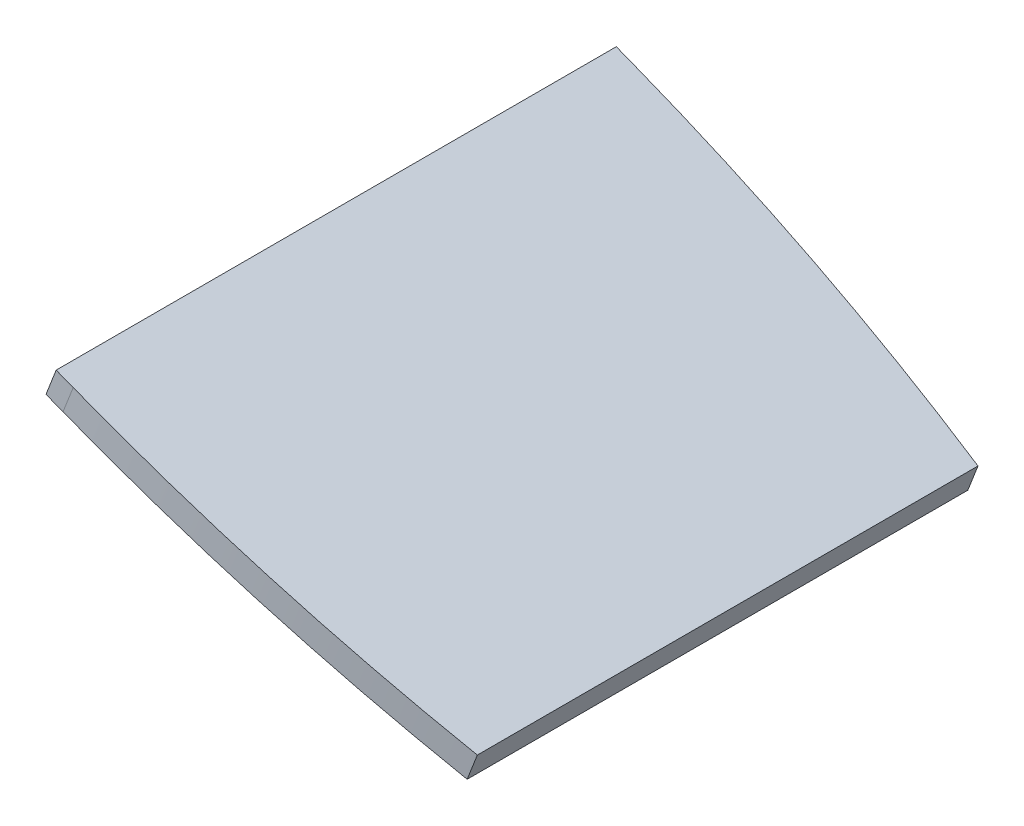
ISO-10303-21;
HEADER;
FILE_DESCRIPTION(('STEP AP214'),'2;1');
FILE_NAME('part.step','',(''),(''),'','','');
FILE_SCHEMA(('AUTOMOTIVE_DESIGN { 1 0 10303 214 1 1 1 1 }'));
ENDSEC;
DATA;
#1=APPLICATION_CONTEXT('core data for automotive mechanical design processes');
#2=APPLICATION_PROTOCOL_DEFINITION('international standard','automotive_design',2000,#1);
#3=PRODUCT_CONTEXT('',#1,'mechanical');
#4=PRODUCT('Part','Part','',(#3));
#5=PRODUCT_RELATED_PRODUCT_CATEGORY('part','',(#4));
#6=PRODUCT_DEFINITION_FORMATION('','',#4);
#7=PRODUCT_DEFINITION_CONTEXT('part definition',#1,'design');
#8=PRODUCT_DEFINITION('design','',#6,#7);
#9=PRODUCT_DEFINITION_SHAPE('','',#8);
#10=(LENGTH_UNIT() NAMED_UNIT(*) SI_UNIT(.MILLI.,.METRE.));
#11=(NAMED_UNIT(*) PLANE_ANGLE_UNIT() SI_UNIT($,.RADIAN.));
#12=(NAMED_UNIT(*) SI_UNIT($,.STERADIAN.) SOLID_ANGLE_UNIT());
#13=UNCERTAINTY_MEASURE_WITH_UNIT(LENGTH_MEASURE(1.E-05),#10,'distance_accuracy_value','');
#14=(GEOMETRIC_REPRESENTATION_CONTEXT(3) GLOBAL_UNCERTAINTY_ASSIGNED_CONTEXT((#13)) GLOBAL_UNIT_ASSIGNED_CONTEXT((#10,
#11,#12)) REPRESENTATION_CONTEXT('',''));
#15=CARTESIAN_POINT('',(0.,0.,0.));
#16=DIRECTION('',(0.,0.,1.));
#17=DIRECTION('',(1.,0.,0.));
#18=AXIS2_PLACEMENT_3D('',#15,#16,#17);
#19=CARTESIAN_POINT('',(-110.439982537775,30.418007524201,254.312671444209));
#20=DIRECTION('',(-0.363059071754713,-0.931766124312644,0.));
#21=DIRECTION('',(0.931766124312644,-0.363059071754713,0.));
#22=AXIS2_PLACEMENT_3D('',#19,#20,#21);
#23=CYLINDRICAL_SURFACE('',#22,247.65);
#24=CARTESIAN_POINT('',(-111.362152580032,28.0513215684469,254.312671444209));
#25=DIRECTION('',(0.363059071754713,0.931766124312644,0.));
#26=DIRECTION('',(-0.931766124312644,0.363059071754713,0.));
#27=AXIS2_PLACEMENT_3D('',#24,#25,#26);
#28=CIRCLE('',#27,247.65);
#29=CARTESIAN_POINT('',(-77.4049918883156,14.8200450512256,9.35886547361028));
#30=VERTEX_POINT('',#29);
#31=CARTESIAN_POINT('',(-111.362152580032,28.0513215684469,6.66267144420909));
#32=VERTEX_POINT('',#31);
#33=EDGE_CURVE('E116',#30,#32,#28,.T.);
#34=ORIENTED_EDGE('',*,*,#33,.T.);
#35=DIRECTION('',(-0.363059071754713,-0.931766124312644,0.));
#36=VECTOR('',#35,1.);
#37=CARTESIAN_POINT('',(-110.439982537775,30.418007524201,6.66267144420909));
#38=LINE('',#37,#36);
#39=CARTESIAN_POINT('',(-110.439982537775,30.418007524201,6.66267144420909));
#40=VERTEX_POINT('',#39);
#41=EDGE_CURVE('E11',#40,#32,#38,.T.);
#42=ORIENTED_EDGE('',*,*,#41,.F.);
#43=CARTESIAN_POINT('',(-110.439982537775,30.418007524201,254.312671444209));
#44=DIRECTION('',(0.363059071754713,0.931766124312644,0.));
#45=DIRECTION('',(-0.931766124312644,0.363059071754713,0.));
#46=AXIS2_PLACEMENT_3D('',#43,#44,#45);
#47=CIRCLE('',#46,247.65);
#48=CARTESIAN_POINT('',(-76.4828218460587,17.1867310069797,9.35886547361028));
#49=VERTEX_POINT('',#48);
#50=EDGE_CURVE('E126',#49,#40,#47,.T.);
#51=ORIENTED_EDGE('',*,*,#50,.F.);
#52=DIRECTION('',(-0.363059071754713,-0.931766124312644,0.));
#53=VECTOR('',#52,1.);
#54=CARTESIAN_POINT('',(-76.4828218460587,17.1867310069797,9.35886547361028));
#55=LINE('',#54,#53);
#56=EDGE_CURVE('E112',#49,#30,#55,.T.);
#57=ORIENTED_EDGE('',*,*,#56,.T.);
#58=EDGE_LOOP('',(#34,#42,#51,#57));
#59=FACE_BOUND('',#58,.T.);
#60=ADVANCED_FACE('F32',(#59),#23,.T.);
#61=CARTESIAN_POINT('',(-110.439982537775,30.418007524201,6.66267144420909));
#62=DIRECTION('',(0.,0.,1.));
#63=DIRECTION('',(1.,0.,0.));
#64=AXIS2_PLACEMENT_3D('',#61,#62,#63);
#65=PLANE('',#64);
#66=DIRECTION('',(-0.931766124312644,0.363059071754714,0.));
#67=VECTOR('',#66,1.);
#68=CARTESIAN_POINT('',(-111.362152580032,28.0513215684469,6.66267144420909));
#69=LINE('',#68,#67);
#70=CARTESIAN_POINT('',(-112.905281224628,28.6525956850803,6.66267144420921));
#71=VERTEX_POINT('',#70);
#72=EDGE_CURVE('E119',#32,#71,#69,.T.);
#73=ORIENTED_EDGE('',*,*,#72,.T.);
#74=DIRECTION('',(-0.363059071754713,-0.931766124312644,0.));
#75=VECTOR('',#74,1.);
#76=CARTESIAN_POINT('',(-111.983111182371,31.0192816408344,6.66267144420921));
#77=LINE('',#76,#75);
#78=CARTESIAN_POINT('',(-111.983111182371,31.0192816408344,6.66267144420921));
#79=VERTEX_POINT('',#78);
#80=EDGE_CURVE('E40',#79,#71,#77,.T.);
#81=ORIENTED_EDGE('',*,*,#80,.F.);
#82=DIRECTION('',(-0.931766124312644,0.363059071754714,0.));
#83=VECTOR('',#82,1.);
#84=CARTESIAN_POINT('',(-110.439982537775,30.418007524201,6.66267144420909));
#85=LINE('',#84,#83);
#86=EDGE_CURVE('E85',#40,#79,#85,.T.);
#87=ORIENTED_EDGE('',*,*,#86,.F.);
#88=ORIENTED_EDGE('',*,*,#41,.T.);
#89=EDGE_LOOP('',(#73,#81,#87,#88));
#90=FACE_BOUND('',#89,.T.);
#91=ADVANCED_FACE('F150',(#90),#65,.F.);
#92=CARTESIAN_POINT('',(-111.983111182371,31.0192816408344,6.66267144420921));
#93=DIRECTION('',(0.931766124312644,-0.363059071754713,0.));
#94=DIRECTION('',(0.363059071754713,0.931766124312644,0.));
#95=AXIS2_PLACEMENT_3D('',#92,#93,#94);
#96=PLANE('',#95);
#97=DIRECTION('',(0.,0.,1.));
#98=VECTOR('',#97,1.);
#99=CARTESIAN_POINT('',(-112.905281224628,28.6525956850803,6.66267144420921));
#100=LINE('',#99,#98);
#101=CARTESIAN_POINT('',(-112.905281224628,28.6525956850803,57.4626714442092));
#102=VERTEX_POINT('',#101);
#103=EDGE_CURVE('E121',#71,#102,#100,.T.);
#104=ORIENTED_EDGE('',*,*,#103,.T.);
#105=DIRECTION('',(-0.363059071754713,-0.931766124312644,0.));
#106=VECTOR('',#105,1.);
#107=CARTESIAN_POINT('',(-111.983111182371,31.0192816408344,57.4626714442092));
#108=LINE('',#107,#106);
#109=CARTESIAN_POINT('',(-111.983111182371,31.0192816408344,57.4626714442092));
#110=VERTEX_POINT('',#109);
#111=EDGE_CURVE('E107',#110,#102,#108,.T.);
#112=ORIENTED_EDGE('',*,*,#111,.F.);
#113=DIRECTION('',(0.,0.,1.));
#114=VECTOR('',#113,1.);
#115=CARTESIAN_POINT('',(-111.983111182371,31.0192816408344,6.66267144420921));
#116=LINE('',#115,#114);
#117=EDGE_CURVE('E98',#79,#110,#116,.T.);
#118=ORIENTED_EDGE('',*,*,#117,.F.);
#119=ORIENTED_EDGE('',*,*,#80,.T.);
#120=EDGE_LOOP('',(#104,#112,#118,#119));
#121=FACE_BOUND('',#120,.T.);
#122=ADVANCED_FACE('F132',(#121),#96,.F.);
#123=CARTESIAN_POINT('',(-111.983111182371,31.0192816408344,57.4626714442092));
#124=DIRECTION('',(0.,0.,-1.));
#125=DIRECTION('',(-1.,0.,0.));
#126=AXIS2_PLACEMENT_3D('',#123,#124,#125);
#127=PLANE('',#126);
#128=DIRECTION('',(0.931766124312643,-0.363059071754716,0.));
#129=VECTOR('',#128,1.);
#130=CARTESIAN_POINT('',(-112.905281224628,28.6525956850803,57.4626714442092));
#131=LINE('',#130,#129);
#132=CARTESIAN_POINT('',(-111.362152580032,28.0513215684469,57.4626714442093));
#133=VERTEX_POINT('',#132);
#134=EDGE_CURVE('E106',#102,#133,#131,.T.);
#135=ORIENTED_EDGE('',*,*,#134,.T.);
#136=DIRECTION('',(-0.363059071754713,-0.931766124312644,0.));
#137=VECTOR('',#136,1.);
#138=CARTESIAN_POINT('',(-110.439982537775,30.418007524201,57.4626714442093));
#139=LINE('',#138,#137);
#140=CARTESIAN_POINT('',(-110.439982537775,30.418007524201,57.4626714442093));
#141=VERTEX_POINT('',#140);
#142=EDGE_CURVE('E103',#141,#133,#139,.T.);
#143=ORIENTED_EDGE('',*,*,#142,.F.);
#144=DIRECTION('',(0.931766124312643,-0.363059071754716,0.));
#145=VECTOR('',#144,1.);
#146=CARTESIAN_POINT('',(-111.983111182371,31.0192816408344,57.4626714442092));
#147=LINE('',#146,#145);
#148=EDGE_CURVE('E92',#110,#141,#147,.T.);
#149=ORIENTED_EDGE('',*,*,#148,.F.);
#150=ORIENTED_EDGE('',*,*,#111,.T.);
#151=EDGE_LOOP('',(#135,#143,#149,#150));
#152=FACE_BOUND('',#151,.T.);
#153=ADVANCED_FACE('F104',(#152),#127,.F.);
#154=CARTESIAN_POINT('',(-110.439982537775,30.418007524201,-190.187328555791));
#155=DIRECTION('',(-0.363059071754713,-0.931766124312644,0.));
#156=DIRECTION('',(0.931766124312644,-0.363059071754713,0.));
#157=AXIS2_PLACEMENT_3D('',#154,#155,#156);
#158=CYLINDRICAL_SURFACE('',#157,247.65);
#159=CARTESIAN_POINT('',(-111.362152580032,28.0513215684469,-190.187328555791));
#160=DIRECTION('',(0.363059071754713,0.931766124312644,0.));
#161=DIRECTION('',(-0.931766124312644,0.363059071754713,0.));
#162=AXIS2_PLACEMENT_3D('',#159,#160,#161);
#163=CIRCLE('',#162,247.65);
#164=CARTESIAN_POINT('',(-77.4049918883158,14.8200450512257,54.7664774148082));
#165=VERTEX_POINT('',#164);
#166=EDGE_CURVE('E71',#133,#165,#163,.T.);
#167=ORIENTED_EDGE('',*,*,#166,.T.);
#168=DIRECTION('',(-0.363059071754713,-0.931766124312644,0.));
#169=VECTOR('',#168,1.);
#170=CARTESIAN_POINT('',(-76.4828218460588,17.1867310069798,54.7664774148082));
#171=LINE('',#170,#169);
#172=CARTESIAN_POINT('',(-76.4828218460588,17.1867310069798,54.7664774148082));
#173=VERTEX_POINT('',#172);
#174=EDGE_CURVE('E108',#173,#165,#171,.T.);
#175=ORIENTED_EDGE('',*,*,#174,.F.);
#176=CARTESIAN_POINT('',(-110.439982537775,30.418007524201,-190.187328555791));
#177=DIRECTION('',(0.363059071754713,0.931766124312644,0.));
#178=DIRECTION('',(-0.931766124312644,0.363059071754713,0.));
#179=AXIS2_PLACEMENT_3D('',#176,#177,#178);
#180=CIRCLE('',#179,247.65);
#181=EDGE_CURVE('E96',#141,#173,#180,.T.);
#182=ORIENTED_EDGE('',*,*,#181,.F.);
#183=ORIENTED_EDGE('',*,*,#142,.T.);
#184=EDGE_LOOP('',(#167,#175,#182,#183));
#185=FACE_BOUND('',#184,.T.);
#186=ADVANCED_FACE('F110',(#185),#158,.T.);
#187=CARTESIAN_POINT('',(-76.4828218460588,17.1867310069798,54.7664774148082));
#188=DIRECTION('',(-0.931766124312644,0.363059071754713,0.));
#189=DIRECTION('',(-0.363059071754713,-0.931766124312644,0.));
#190=AXIS2_PLACEMENT_3D('',#187,#188,#189);
#191=PLANE('',#190);
#192=DIRECTION('',(0.,0.,-1.));
#193=VECTOR('',#192,1.);
#194=CARTESIAN_POINT('',(-77.4049918883158,14.8200450512257,54.7664774148082));
#195=LINE('',#194,#193);
#196=EDGE_CURVE('E77',#165,#30,#195,.T.);
#197=ORIENTED_EDGE('',*,*,#196,.T.);
#198=ORIENTED_EDGE('',*,*,#56,.F.);
#199=DIRECTION('',(0.,0.,-1.));
#200=VECTOR('',#199,1.);
#201=CARTESIAN_POINT('',(-76.4828218460588,17.1867310069798,54.7664774148082));
#202=LINE('',#201,#200);
#203=EDGE_CURVE('E48',#173,#49,#202,.T.);
#204=ORIENTED_EDGE('',*,*,#203,.F.);
#205=ORIENTED_EDGE('',*,*,#174,.T.);
#206=EDGE_LOOP('',(#197,#198,#204,#205));
#207=FACE_BOUND('',#206,.T.);
#208=ADVANCED_FACE('F139',(#207),#191,.F.);
#209=CARTESIAN_POINT('',(-110.439982537775,30.418007524201,254.312671444209));
#210=DIRECTION('',(0.363059071754713,0.931766124312644,0.));
#211=DIRECTION('',(-0.931766124312644,0.363059071754713,0.));
#212=AXIS2_PLACEMENT_3D('',#209,#210,#211);
#213=PLANE('',#212);
#214=ORIENTED_EDGE('',*,*,#50,.T.);
#215=ORIENTED_EDGE('',*,*,#86,.T.);
#216=ORIENTED_EDGE('',*,*,#117,.T.);
#217=ORIENTED_EDGE('',*,*,#148,.T.);
#218=ORIENTED_EDGE('',*,*,#181,.T.);
#219=ORIENTED_EDGE('',*,*,#203,.T.);
#220=EDGE_LOOP('',(#214,#215,#216,#217,#218,#219));
#221=FACE_BOUND('',#220,.T.);
#222=ADVANCED_FACE('F94',(#221),#213,.T.);
#223=CARTESIAN_POINT('',(-111.362152580032,28.0513215684469,254.312671444209));
#224=DIRECTION('',(0.363059071754713,0.931766124312644,0.));
#225=DIRECTION('',(-0.931766124312644,0.363059071754713,0.));
#226=AXIS2_PLACEMENT_3D('',#223,#224,#225);
#227=PLANE('',#226);
#228=ORIENTED_EDGE('',*,*,#33,.F.);
#229=ORIENTED_EDGE('',*,*,#196,.F.);
#230=ORIENTED_EDGE('',*,*,#166,.F.);
#231=ORIENTED_EDGE('',*,*,#134,.F.);
#232=ORIENTED_EDGE('',*,*,#103,.F.);
#233=ORIENTED_EDGE('',*,*,#72,.F.);
#234=EDGE_LOOP('',(#228,#229,#230,#231,#232,#233));
#235=FACE_BOUND('',#234,.T.);
#236=ADVANCED_FACE('F135',(#235),#227,.F.);
#237=CLOSED_SHELL('',(#60,#91,#122,#153,#186,#208,#222,#236));
#238=MANIFOLD_SOLID_BREP('B2',#237);
#239=ADVANCED_BREP_SHAPE_REPRESENTATION('',(#18,#238),#14);
#240=SHAPE_DEFINITION_REPRESENTATION(#9,#239);
ENDSEC;
END-ISO-10303-21;
